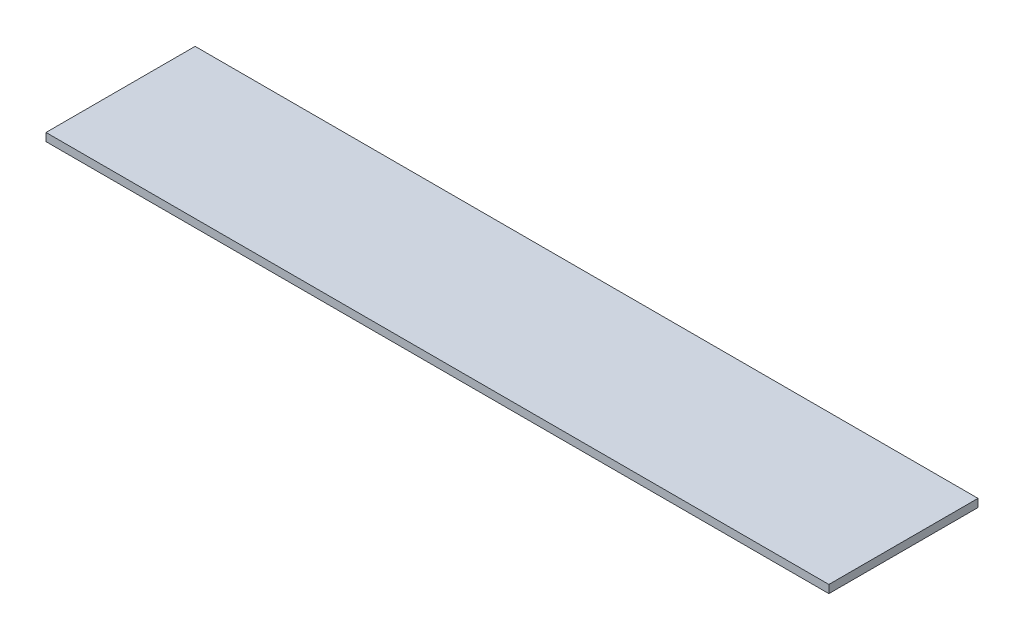
ISO-10303-21;
HEADER;
FILE_DESCRIPTION(('STEP AP214'),'2;1');
FILE_NAME('part.step','',(''),(''),'','','');
FILE_SCHEMA(('AUTOMOTIVE_DESIGN { 1 0 10303 214 1 1 1 1 }'));
ENDSEC;
DATA;
#1=APPLICATION_CONTEXT('core data for automotive mechanical design processes');
#2=APPLICATION_PROTOCOL_DEFINITION('international standard','automotive_design',2000,#1);
#3=PRODUCT_CONTEXT('',#1,'mechanical');
#4=PRODUCT('Part','Part','',(#3));
#5=PRODUCT_RELATED_PRODUCT_CATEGORY('part','',(#4));
#6=PRODUCT_DEFINITION_FORMATION('','',#4);
#7=PRODUCT_DEFINITION_CONTEXT('part definition',#1,'design');
#8=PRODUCT_DEFINITION('design','',#6,#7);
#9=PRODUCT_DEFINITION_SHAPE('','',#8);
#10=(LENGTH_UNIT() NAMED_UNIT(*) SI_UNIT(.MILLI.,.METRE.));
#11=(NAMED_UNIT(*) PLANE_ANGLE_UNIT() SI_UNIT($,.RADIAN.));
#12=(NAMED_UNIT(*) SI_UNIT($,.STERADIAN.) SOLID_ANGLE_UNIT());
#13=UNCERTAINTY_MEASURE_WITH_UNIT(LENGTH_MEASURE(1.E-05),#10,'distance_accuracy_value','');
#14=(GEOMETRIC_REPRESENTATION_CONTEXT(3) GLOBAL_UNCERTAINTY_ASSIGNED_CONTEXT((#13)) GLOBAL_UNIT_ASSIGNED_CONTEXT((#10,
#11,#12)) REPRESENTATION_CONTEXT('',''));
#15=CARTESIAN_POINT('',(0.,0.,0.));
#16=DIRECTION('',(0.,0.,1.));
#17=DIRECTION('',(1.,0.,0.));
#18=AXIS2_PLACEMENT_3D('',#15,#16,#17);
#19=CARTESIAN_POINT('',(-933.45,19.05,177.8));
#20=DIRECTION('',(1.,0.,0.));
#21=DIRECTION('',(0.,0.,-1.));
#22=AXIS2_PLACEMENT_3D('',#19,#20,#21);
#23=PLANE('',#22);
#24=DIRECTION('',(0.,0.,1.));
#25=VECTOR('',#24,1.);
#26=CARTESIAN_POINT('',(-933.45,0.,177.8));
#27=LINE('',#26,#25);
#28=CARTESIAN_POINT('',(-933.45,0.,-177.8));
#29=VERTEX_POINT('',#28);
#30=CARTESIAN_POINT('',(-933.45,0.,177.8));
#31=VERTEX_POINT('',#30);
#32=EDGE_CURVE('E95',#29,#31,#27,.T.);
#33=ORIENTED_EDGE('',*,*,#32,.T.);
#34=DIRECTION('',(0.,-1.,0.));
#35=VECTOR('',#34,1.);
#36=CARTESIAN_POINT('',(-933.45,19.05,177.8));
#37=LINE('',#36,#35);
#38=CARTESIAN_POINT('',(-933.45,19.05,177.8));
#39=VERTEX_POINT('',#38);
#40=EDGE_CURVE('E11',#39,#31,#37,.T.);
#41=ORIENTED_EDGE('',*,*,#40,.F.);
#42=DIRECTION('',(0.,0.,1.));
#43=VECTOR('',#42,1.);
#44=CARTESIAN_POINT('',(-933.45,19.05,177.8));
#45=LINE('',#44,#43);
#46=CARTESIAN_POINT('',(-933.45,19.05,-177.8));
#47=VERTEX_POINT('',#46);
#48=EDGE_CURVE('E83',#47,#39,#45,.T.);
#49=ORIENTED_EDGE('',*,*,#48,.F.);
#50=DIRECTION('',(0.,-1.,0.));
#51=VECTOR('',#50,1.);
#52=CARTESIAN_POINT('',(-933.45,19.05,-177.8));
#53=LINE('',#52,#51);
#54=EDGE_CURVE('E91',#47,#29,#53,.T.);
#55=ORIENTED_EDGE('',*,*,#54,.T.);
#56=EDGE_LOOP('',(#33,#41,#49,#55));
#57=FACE_BOUND('',#56,.T.);
#58=ADVANCED_FACE('F32',(#57),#23,.F.);
#59=CARTESIAN_POINT('',(933.45,19.05,177.8));
#60=DIRECTION('',(0.,0.,-1.));
#61=DIRECTION('',(-1.,0.,0.));
#62=AXIS2_PLACEMENT_3D('',#59,#60,#61);
#63=PLANE('',#62);
#64=DIRECTION('',(1.,0.,0.));
#65=VECTOR('',#64,1.);
#66=CARTESIAN_POINT('',(933.45,0.,177.8));
#67=LINE('',#66,#65);
#68=CARTESIAN_POINT('',(933.45,0.,177.8));
#69=VERTEX_POINT('',#68);
#70=EDGE_CURVE('E87',#31,#69,#67,.T.);
#71=ORIENTED_EDGE('',*,*,#70,.T.);
#72=DIRECTION('',(0.,-1.,0.));
#73=VECTOR('',#72,1.);
#74=CARTESIAN_POINT('',(933.45,19.05,177.8));
#75=LINE('',#74,#73);
#76=CARTESIAN_POINT('',(933.45,19.05,177.8));
#77=VERTEX_POINT('',#76);
#78=EDGE_CURVE('E40',#77,#69,#75,.T.);
#79=ORIENTED_EDGE('',*,*,#78,.F.);
#80=DIRECTION('',(1.,0.,0.));
#81=VECTOR('',#80,1.);
#82=CARTESIAN_POINT('',(933.45,19.05,177.8));
#83=LINE('',#82,#81);
#84=EDGE_CURVE('E78',#39,#77,#83,.T.);
#85=ORIENTED_EDGE('',*,*,#84,.F.);
#86=ORIENTED_EDGE('',*,*,#40,.T.);
#87=EDGE_LOOP('',(#71,#79,#85,#86));
#88=FACE_BOUND('',#87,.T.);
#89=ADVANCED_FACE('F86',(#88),#63,.F.);
#90=CARTESIAN_POINT('',(933.45,19.05,177.8));
#91=DIRECTION('',(-1.,0.,0.));
#92=DIRECTION('',(0.,0.,1.));
#93=AXIS2_PLACEMENT_3D('',#90,#91,#92);
#94=PLANE('',#93);
#95=DIRECTION('',(0.,0.,-1.));
#96=VECTOR('',#95,1.);
#97=CARTESIAN_POINT('',(933.45,0.,177.8));
#98=LINE('',#97,#96);
#99=CARTESIAN_POINT('',(933.45,0.,-177.8));
#100=VERTEX_POINT('',#99);
#101=EDGE_CURVE('E65',#69,#100,#98,.T.);
#102=ORIENTED_EDGE('',*,*,#101,.T.);
#103=DIRECTION('',(0.,-1.,0.));
#104=VECTOR('',#103,1.);
#105=CARTESIAN_POINT('',(933.45,19.05,-177.8));
#106=LINE('',#105,#104);
#107=CARTESIAN_POINT('',(933.45,19.05,-177.8));
#108=VERTEX_POINT('',#107);
#109=EDGE_CURVE('E88',#108,#100,#106,.T.);
#110=ORIENTED_EDGE('',*,*,#109,.F.);
#111=DIRECTION('',(0.,0.,-1.));
#112=VECTOR('',#111,1.);
#113=CARTESIAN_POINT('',(933.45,19.05,177.8));
#114=LINE('',#113,#112);
#115=EDGE_CURVE('E81',#77,#108,#114,.T.);
#116=ORIENTED_EDGE('',*,*,#115,.F.);
#117=ORIENTED_EDGE('',*,*,#78,.T.);
#118=EDGE_LOOP('',(#102,#110,#116,#117));
#119=FACE_BOUND('',#118,.T.);
#120=ADVANCED_FACE('F89',(#119),#94,.F.);
#121=CARTESIAN_POINT('',(933.45,19.05,-177.8));
#122=DIRECTION('',(0.,0.,1.));
#123=DIRECTION('',(1.,0.,0.));
#124=AXIS2_PLACEMENT_3D('',#121,#122,#123);
#125=PLANE('',#124);
#126=DIRECTION('',(-1.,0.,0.));
#127=VECTOR('',#126,1.);
#128=CARTESIAN_POINT('',(933.45,0.,-177.8));
#129=LINE('',#128,#127);
#130=EDGE_CURVE('E71',#100,#29,#129,.T.);
#131=ORIENTED_EDGE('',*,*,#130,.T.);
#132=ORIENTED_EDGE('',*,*,#54,.F.);
#133=DIRECTION('',(-1.,0.,0.));
#134=VECTOR('',#133,1.);
#135=CARTESIAN_POINT('',(933.45,19.05,-177.8));
#136=LINE('',#135,#134);
#137=EDGE_CURVE('E48',#108,#47,#136,.T.);
#138=ORIENTED_EDGE('',*,*,#137,.F.);
#139=ORIENTED_EDGE('',*,*,#109,.T.);
#140=EDGE_LOOP('',(#131,#132,#138,#139));
#141=FACE_BOUND('',#140,.T.);
#142=ADVANCED_FACE('F102',(#141),#125,.F.);
#143=CARTESIAN_POINT('',(0.,19.05,0.));
#144=DIRECTION('',(0.,1.,0.));
#145=DIRECTION('',(0.,0.,1.));
#146=AXIS2_PLACEMENT_3D('',#143,#144,#145);
#147=PLANE('',#146);
#148=ORIENTED_EDGE('',*,*,#48,.T.);
#149=ORIENTED_EDGE('',*,*,#84,.T.);
#150=ORIENTED_EDGE('',*,*,#115,.T.);
#151=ORIENTED_EDGE('',*,*,#137,.T.);
#152=EDGE_LOOP('',(#148,#149,#150,#151));
#153=FACE_BOUND('',#152,.T.);
#154=ADVANCED_FACE('F79',(#153),#147,.T.);
#155=CARTESIAN_POINT('',(0.,0.,0.));
#156=DIRECTION('',(0.,1.,0.));
#157=DIRECTION('',(0.,0.,1.));
#158=AXIS2_PLACEMENT_3D('',#155,#156,#157);
#159=PLANE('',#158);
#160=ORIENTED_EDGE('',*,*,#32,.F.);
#161=ORIENTED_EDGE('',*,*,#130,.F.);
#162=ORIENTED_EDGE('',*,*,#101,.F.);
#163=ORIENTED_EDGE('',*,*,#70,.F.);
#164=EDGE_LOOP('',(#160,#161,#162,#163));
#165=FACE_BOUND('',#164,.T.);
#166=ADVANCED_FACE('F105',(#165),#159,.F.);
#167=CLOSED_SHELL('',(#58,#89,#120,#142,#154,#166));
#168=MANIFOLD_SOLID_BREP('B2',#167);
#169=ADVANCED_BREP_SHAPE_REPRESENTATION('',(#18,#168),#14);
#170=SHAPE_DEFINITION_REPRESENTATION(#9,#169);
ENDSEC;
END-ISO-10303-21;
